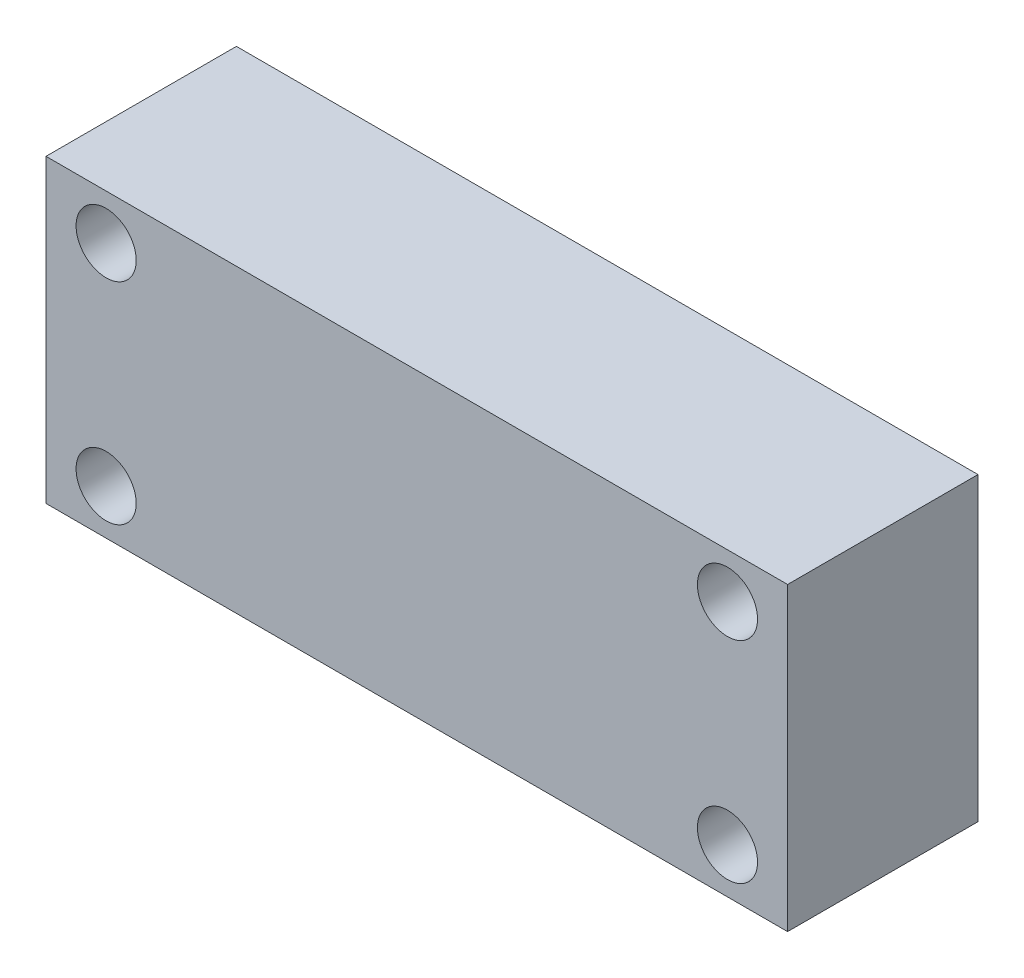
ISO-10303-21;
HEADER;
FILE_DESCRIPTION(('STEP AP214'),'2;1');
FILE_NAME('part.step','',(''),(''),'','','');
FILE_SCHEMA(('AUTOMOTIVE_DESIGN { 1 0 10303 214 1 1 1 1 }'));
ENDSEC;
DATA;
#1=APPLICATION_CONTEXT('core data for automotive mechanical design processes');
#2=APPLICATION_PROTOCOL_DEFINITION('international standard','automotive_design',2000,#1);
#3=PRODUCT_CONTEXT('',#1,'mechanical');
#4=PRODUCT('Part','Part','',(#3));
#5=PRODUCT_RELATED_PRODUCT_CATEGORY('part','',(#4));
#6=PRODUCT_DEFINITION_FORMATION('','',#4);
#7=PRODUCT_DEFINITION_CONTEXT('part definition',#1,'design');
#8=PRODUCT_DEFINITION('design','',#6,#7);
#9=PRODUCT_DEFINITION_SHAPE('','',#8);
#10=(LENGTH_UNIT() NAMED_UNIT(*) SI_UNIT(.MILLI.,.METRE.));
#11=(NAMED_UNIT(*) PLANE_ANGLE_UNIT() SI_UNIT($,.RADIAN.));
#12=(NAMED_UNIT(*) SI_UNIT($,.STERADIAN.) SOLID_ANGLE_UNIT());
#13=UNCERTAINTY_MEASURE_WITH_UNIT(LENGTH_MEASURE(1.E-05),#10,'distance_accuracy_value','');
#14=(GEOMETRIC_REPRESENTATION_CONTEXT(3) GLOBAL_UNCERTAINTY_ASSIGNED_CONTEXT((#13)) GLOBAL_UNIT_ASSIGNED_CONTEXT((#10,
#11,#12)) REPRESENTATION_CONTEXT('',''));
#15=CARTESIAN_POINT('',(0.,0.,0.));
#16=DIRECTION('',(0.,0.,1.));
#17=DIRECTION('',(1.,0.,0.));
#18=AXIS2_PLACEMENT_3D('',#15,#16,#17);
#19=CARTESIAN_POINT('',(21.,0.,-10.));
#20=DIRECTION('',(0.,0.,1.));
#21=DIRECTION('',(1.,0.,0.));
#22=AXIS2_PLACEMENT_3D('',#19,#20,#21);
#23=PLANE('',#22);
#24=CARTESIAN_POINT('',(21.,0.,-10.));
#25=DIRECTION('',(0.,0.,1.));
#26=DIRECTION('',(1.,0.,0.));
#27=AXIS2_PLACEMENT_3D('',#24,#25,#26);
#28=CIRCLE('',#27,5.);
#29=CARTESIAN_POINT('',(26.,0.,-10.));
#30=VERTEX_POINT('',#29);
#31=EDGE_CURVE('E11',#30,#30,#28,.T.);
#32=ORIENTED_EDGE('',*,*,#31,.F.);
#33=EDGE_LOOP('',(#32));
#34=FACE_BOUND('',#33,.T.);
#35=ADVANCED_FACE('F17',(#34),#23,.F.);
#36=CARTESIAN_POINT('',(21.,0.,-10.));
#37=DIRECTION('',(0.,0.,-1.));
#38=DIRECTION('',(-1.,0.,0.));
#39=AXIS2_PLACEMENT_3D('',#36,#37,#38);
#40=CYLINDRICAL_SURFACE('',#39,5.);
#41=CARTESIAN_POINT('',(21.,0.,-20.));
#42=DIRECTION('',(0.,0.,1.));
#43=DIRECTION('',(1.,0.,0.));
#44=AXIS2_PLACEMENT_3D('',#41,#42,#43);
#45=CIRCLE('',#44,5.);
#46=CARTESIAN_POINT('',(26.,0.,-20.));
#47=VERTEX_POINT('',#46);
#48=EDGE_CURVE('E196',#47,#47,#45,.T.);
#49=ORIENTED_EDGE('',*,*,#48,.F.);
#50=EDGE_LOOP('',(#49));
#51=FACE_BOUND('',#50,.T.);
#52=ORIENTED_EDGE('',*,*,#31,.T.);
#53=EDGE_LOOP('',(#52));
#54=FACE_BOUND('',#53,.T.);
#55=ADVANCED_FACE('F268',(#51,#54),#40,.F.);
#56=CARTESIAN_POINT('',(-37.,15.,-19.));
#57=DIRECTION('',(-0.707106781186548,0.,-0.707106781186548));
#58=DIRECTION('',(-0.707106781186548,0.,0.707106781186548));
#59=AXIS2_PLACEMENT_3D('',#56,#57,#58);
#60=PLANE('',#59);
#61=DIRECTION('',(0.577350269189626,-0.577350269189626,-0.577350269189626));
#62=VECTOR('',#61,1.);
#63=CARTESIAN_POINT('',(-12.3333333333333,-9.66666666666667,-43.6666666666667));
#64=LINE('',#63,#62);
#65=CARTESIAN_POINT('',(-37.,15.,-19.));
#66=VERTEX_POINT('',#65);
#67=CARTESIAN_POINT('',(-36.,14.,-20.));
#68=VERTEX_POINT('',#67);
#69=EDGE_CURVE('E135',#66,#68,#64,.T.);
#70=ORIENTED_EDGE('',*,*,#69,.T.);
#71=DIRECTION('',(0.,1.,0.));
#72=VECTOR('',#71,1.);
#73=CARTESIAN_POINT('',(-36.,15.,-20.));
#74=LINE('',#73,#72);
#75=CARTESIAN_POINT('',(-36.,-14.,-20.));
#76=VERTEX_POINT('',#75);
#77=EDGE_CURVE('E129',#76,#68,#74,.T.);
#78=ORIENTED_EDGE('',*,*,#77,.F.);
#79=DIRECTION('',(-0.577350269189626,-0.577350269189626,0.577350269189626));
#80=VECTOR('',#79,1.);
#81=CARTESIAN_POINT('',(-37.,-15.,-19.));
#82=LINE('',#81,#80);
#83=CARTESIAN_POINT('',(-37.,-15.,-19.));
#84=VERTEX_POINT('',#83);
#85=EDGE_CURVE('E25',#76,#84,#82,.T.);
#86=ORIENTED_EDGE('',*,*,#85,.T.);
#87=DIRECTION('',(0.,-1.,0.));
#88=VECTOR('',#87,1.);
#89=CARTESIAN_POINT('',(-37.,-15.,-19.));
#90=LINE('',#89,#88);
#91=EDGE_CURVE('E126',#66,#84,#90,.T.);
#92=ORIENTED_EDGE('',*,*,#91,.F.);
#93=EDGE_LOOP('',(#70,#78,#86,#92));
#94=FACE_BOUND('',#93,.T.);
#95=ADVANCED_FACE('F125',(#94),#60,.T.);
#96=CARTESIAN_POINT('',(-37.,-15.,-19.));
#97=DIRECTION('',(0.,-0.707106781186548,-0.707106781186548));
#98=DIRECTION('',(0.,-0.707106781186548,0.707106781186548));
#99=AXIS2_PLACEMENT_3D('',#96,#97,#98);
#100=PLANE('',#99);
#101=DIRECTION('',(0.577350269189626,-0.577350269189626,0.577350269189626));
#102=VECTOR('',#101,1.);
#103=CARTESIAN_POINT('',(12.3333333333333,9.66666666666667,-43.6666666666667));
#104=LINE('',#103,#102);
#105=CARTESIAN_POINT('',(36.,-14.,-20.));
#106=VERTEX_POINT('',#105);
#107=CARTESIAN_POINT('',(37.,-15.,-19.));
#108=VERTEX_POINT('',#107);
#109=EDGE_CURVE('E151',#106,#108,#104,.T.);
#110=ORIENTED_EDGE('',*,*,#109,.T.);
#111=DIRECTION('',(1.,0.,0.));
#112=VECTOR('',#111,1.);
#113=CARTESIAN_POINT('',(37.,-15.,-19.));
#114=LINE('',#113,#112);
#115=EDGE_CURVE('E149',#84,#108,#114,.T.);
#116=ORIENTED_EDGE('',*,*,#115,.F.);
#117=ORIENTED_EDGE('',*,*,#85,.F.);
#118=DIRECTION('',(-1.,0.,0.));
#119=VECTOR('',#118,1.);
#120=CARTESIAN_POINT('',(-37.,-14.,-20.));
#121=LINE('',#120,#119);
#122=EDGE_CURVE('E178',#106,#76,#121,.T.);
#123=ORIENTED_EDGE('',*,*,#122,.F.);
#124=EDGE_LOOP('',(#110,#116,#117,#123));
#125=FACE_BOUND('',#124,.T.);
#126=ADVANCED_FACE('F150',(#125),#100,.T.);
#127=CARTESIAN_POINT('',(37.,15.,-19.));
#128=DIRECTION('',(0.,0.707106781186548,-0.707106781186548));
#129=DIRECTION('',(-1.,0.,0.));
#130=AXIS2_PLACEMENT_3D('',#127,#128,#129);
#131=PLANE('',#130);
#132=DIRECTION('',(-0.577350269189626,-0.577350269189626,-0.577350269189626));
#133=VECTOR('',#132,1.);
#134=CARTESIAN_POINT('',(27.,5.,-29.));
#135=LINE('',#134,#133);
#136=CARTESIAN_POINT('',(37.,15.,-19.));
#137=VERTEX_POINT('',#136);
#138=CARTESIAN_POINT('',(36.,14.,-20.));
#139=VERTEX_POINT('',#138);
#140=EDGE_CURVE('E233',#137,#139,#135,.T.);
#141=ORIENTED_EDGE('',*,*,#140,.T.);
#142=DIRECTION('',(1.,0.,0.));
#143=VECTOR('',#142,1.);
#144=CARTESIAN_POINT('',(37.,14.,-20.));
#145=LINE('',#144,#143);
#146=EDGE_CURVE('E177',#68,#139,#145,.T.);
#147=ORIENTED_EDGE('',*,*,#146,.F.);
#148=ORIENTED_EDGE('',*,*,#69,.F.);
#149=DIRECTION('',(-1.,0.,0.));
#150=VECTOR('',#149,1.);
#151=CARTESIAN_POINT('',(-37.,15.,-19.));
#152=LINE('',#151,#150);
#153=EDGE_CURVE('E168',#137,#66,#152,.T.);
#154=ORIENTED_EDGE('',*,*,#153,.F.);
#155=EDGE_LOOP('',(#141,#147,#148,#154));
#156=FACE_BOUND('',#155,.T.);
#157=ADVANCED_FACE('F241',(#156),#131,.T.);
#158=CARTESIAN_POINT('',(37.,-15.,-19.));
#159=DIRECTION('',(0.707106781186548,0.,-0.707106781186548));
#160=DIRECTION('',(0.,-1.,0.));
#161=AXIS2_PLACEMENT_3D('',#158,#159,#160);
#162=PLANE('',#161);
#163=ORIENTED_EDGE('',*,*,#109,.F.);
#164=DIRECTION('',(0.,-1.,0.));
#165=VECTOR('',#164,1.);
#166=CARTESIAN_POINT('',(36.,-15.,-20.));
#167=LINE('',#166,#165);
#168=EDGE_CURVE('E204',#139,#106,#167,.T.);
#169=ORIENTED_EDGE('',*,*,#168,.F.);
#170=ORIENTED_EDGE('',*,*,#140,.F.);
#171=DIRECTION('',(0.,1.,0.));
#172=VECTOR('',#171,1.);
#173=CARTESIAN_POINT('',(37.,15.,-19.));
#174=LINE('',#173,#172);
#175=EDGE_CURVE('E174',#108,#137,#174,.T.);
#176=ORIENTED_EDGE('',*,*,#175,.F.);
#177=EDGE_LOOP('',(#163,#169,#170,#176));
#178=FACE_BOUND('',#177,.T.);
#179=ADVANCED_FACE('F247',(#178),#162,.T.);
#180=CARTESIAN_POINT('',(31.,10.5,11.7554473412205));
#181=DIRECTION('',(0.,0.,-1.));
#182=DIRECTION('',(-1.,0.,0.));
#183=AXIS2_PLACEMENT_3D('',#180,#181,#182);
#184=CYLINDRICAL_SURFACE('',#183,3.);
#185=CARTESIAN_POINT('',(31.,10.5,-20.));
#186=DIRECTION('',(0.,0.,1.));
#187=DIRECTION('',(1.,0.,0.));
#188=AXIS2_PLACEMENT_3D('',#185,#186,#187);
#189=CIRCLE('',#188,3.);
#190=CARTESIAN_POINT('',(34.,10.5,-20.));
#191=VERTEX_POINT('',#190);
#192=EDGE_CURVE('E208',#191,#191,#189,.T.);
#193=ORIENTED_EDGE('',*,*,#192,.F.);
#194=EDGE_LOOP('',(#193));
#195=FACE_BOUND('',#194,.T.);
#196=CARTESIAN_POINT('',(31.,10.5,0.));
#197=DIRECTION('',(0.,0.,-1.));
#198=DIRECTION('',(1.,0.,0.));
#199=AXIS2_PLACEMENT_3D('',#196,#197,#198);
#200=CIRCLE('',#199,3.);
#201=CARTESIAN_POINT('',(34.,10.5,0.));
#202=VERTEX_POINT('',#201);
#203=EDGE_CURVE('E220',#202,#202,#200,.T.);
#204=ORIENTED_EDGE('',*,*,#203,.F.);
#205=EDGE_LOOP('',(#204));
#206=FACE_BOUND('',#205,.T.);
#207=ADVANCED_FACE('F355',(#195,#206),#184,.F.);
#208=CARTESIAN_POINT('',(31.,-10.5,11.7554473412205));
#209=DIRECTION('',(0.,0.,-1.));
#210=DIRECTION('',(-1.,0.,0.));
#211=AXIS2_PLACEMENT_3D('',#208,#209,#210);
#212=CYLINDRICAL_SURFACE('',#211,3.);
#213=CARTESIAN_POINT('',(31.,-10.5,-20.));
#214=DIRECTION('',(0.,0.,1.));
#215=DIRECTION('',(1.,0.,0.));
#216=AXIS2_PLACEMENT_3D('',#213,#214,#215);
#217=CIRCLE('',#216,3.);
#218=CARTESIAN_POINT('',(34.,-10.5,-20.));
#219=VERTEX_POINT('',#218);
#220=EDGE_CURVE('E211',#219,#219,#217,.T.);
#221=ORIENTED_EDGE('',*,*,#220,.F.);
#222=EDGE_LOOP('',(#221));
#223=FACE_BOUND('',#222,.T.);
#224=CARTESIAN_POINT('',(31.,-10.5,0.));
#225=DIRECTION('',(0.,0.,-1.));
#226=DIRECTION('',(1.,0.,0.));
#227=AXIS2_PLACEMENT_3D('',#224,#225,#226);
#228=CIRCLE('',#227,3.);
#229=CARTESIAN_POINT('',(34.,-10.5,0.));
#230=VERTEX_POINT('',#229);
#231=EDGE_CURVE('E223',#230,#230,#228,.T.);
#232=ORIENTED_EDGE('',*,*,#231,.F.);
#233=EDGE_LOOP('',(#232));
#234=FACE_BOUND('',#233,.T.);
#235=ADVANCED_FACE('F344',(#223,#234),#212,.F.);
#236=CARTESIAN_POINT('',(-31.,10.5,11.7554473412205));
#237=DIRECTION('',(0.,0.,-1.));
#238=DIRECTION('',(-1.,0.,0.));
#239=AXIS2_PLACEMENT_3D('',#236,#237,#238);
#240=CYLINDRICAL_SURFACE('',#239,3.);
#241=CARTESIAN_POINT('',(-31.,10.5,-20.));
#242=DIRECTION('',(0.,0.,1.));
#243=DIRECTION('',(1.,0.,0.));
#244=AXIS2_PLACEMENT_3D('',#241,#242,#243);
#245=CIRCLE('',#244,3.);
#246=CARTESIAN_POINT('',(-28.,10.5,-20.));
#247=VERTEX_POINT('',#246);
#248=EDGE_CURVE('E214',#247,#247,#245,.T.);
#249=ORIENTED_EDGE('',*,*,#248,.F.);
#250=EDGE_LOOP('',(#249));
#251=FACE_BOUND('',#250,.T.);
#252=CARTESIAN_POINT('',(-31.,10.5,0.));
#253=DIRECTION('',(0.,0.,-1.));
#254=DIRECTION('',(1.,0.,0.));
#255=AXIS2_PLACEMENT_3D('',#252,#253,#254);
#256=CIRCLE('',#255,3.);
#257=CARTESIAN_POINT('',(-28.,10.5,0.));
#258=VERTEX_POINT('',#257);
#259=EDGE_CURVE('E226',#258,#258,#256,.T.);
#260=ORIENTED_EDGE('',*,*,#259,.F.);
#261=EDGE_LOOP('',(#260));
#262=FACE_BOUND('',#261,.T.);
#263=ADVANCED_FACE('F333',(#251,#262),#240,.F.);
#264=CARTESIAN_POINT('',(-31.,-10.5,11.7554473412205));
#265=DIRECTION('',(0.,0.,-1.));
#266=DIRECTION('',(-1.,0.,0.));
#267=AXIS2_PLACEMENT_3D('',#264,#265,#266);
#268=CYLINDRICAL_SURFACE('',#267,3.);
#269=CARTESIAN_POINT('',(-31.,-10.5,-20.));
#270=DIRECTION('',(0.,0.,1.));
#271=DIRECTION('',(1.,0.,0.));
#272=AXIS2_PLACEMENT_3D('',#269,#270,#271);
#273=CIRCLE('',#272,3.);
#274=CARTESIAN_POINT('',(-28.,-10.5,-20.));
#275=VERTEX_POINT('',#274);
#276=EDGE_CURVE('E217',#275,#275,#273,.T.);
#277=ORIENTED_EDGE('',*,*,#276,.F.);
#278=EDGE_LOOP('',(#277));
#279=FACE_BOUND('',#278,.T.);
#280=CARTESIAN_POINT('',(-31.,-10.5,0.));
#281=DIRECTION('',(0.,0.,-1.));
#282=DIRECTION('',(1.,0.,0.));
#283=AXIS2_PLACEMENT_3D('',#280,#281,#282);
#284=CIRCLE('',#283,3.);
#285=CARTESIAN_POINT('',(-28.,-10.5,0.));
#286=VERTEX_POINT('',#285);
#287=EDGE_CURVE('E40',#286,#286,#284,.T.);
#288=ORIENTED_EDGE('',*,*,#287,.F.);
#289=EDGE_LOOP('',(#288));
#290=FACE_BOUND('',#289,.T.);
#291=ADVANCED_FACE('F323',(#279,#290),#268,.F.);
#292=CARTESIAN_POINT('',(0.,0.,0.));
#293=DIRECTION('',(0.,0.,1.));
#294=DIRECTION('',(1.,0.,0.));
#295=AXIS2_PLACEMENT_3D('',#292,#293,#294);
#296=PLANE('',#295);
#297=DIRECTION('',(1.,0.,0.));
#298=VECTOR('',#297,1.);
#299=CARTESIAN_POINT('',(-37.,-15.,0.));
#300=LINE('',#299,#298);
#301=CARTESIAN_POINT('',(-37.,-15.,0.));
#302=VERTEX_POINT('',#301);
#303=CARTESIAN_POINT('',(37.,-15.,0.));
#304=VERTEX_POINT('',#303);
#305=EDGE_CURVE('E161',#302,#304,#300,.T.);
#306=ORIENTED_EDGE('',*,*,#305,.T.);
#307=DIRECTION('',(0.,1.,0.));
#308=VECTOR('',#307,1.);
#309=CARTESIAN_POINT('',(37.,-15.,0.));
#310=LINE('',#309,#308);
#311=CARTESIAN_POINT('',(37.,15.,0.));
#312=VERTEX_POINT('',#311);
#313=EDGE_CURVE('E171',#304,#312,#310,.T.);
#314=ORIENTED_EDGE('',*,*,#313,.T.);
#315=DIRECTION('',(-1.,0.,0.));
#316=VECTOR('',#315,1.);
#317=CARTESIAN_POINT('',(37.,15.,0.));
#318=LINE('',#317,#316);
#319=CARTESIAN_POINT('',(-37.,15.,0.));
#320=VERTEX_POINT('',#319);
#321=EDGE_CURVE('E146',#312,#320,#318,.T.);
#322=ORIENTED_EDGE('',*,*,#321,.T.);
#323=DIRECTION('',(0.,-1.,0.));
#324=VECTOR('',#323,1.);
#325=CARTESIAN_POINT('',(-37.,15.,0.));
#326=LINE('',#325,#324);
#327=EDGE_CURVE('E145',#320,#302,#326,.T.);
#328=ORIENTED_EDGE('',*,*,#327,.T.);
#329=EDGE_LOOP('',(#306,#314,#322,#328));
#330=FACE_BOUND('',#329,.T.);
#331=ORIENTED_EDGE('',*,*,#287,.T.);
#332=EDGE_LOOP('',(#331));
#333=FACE_BOUND('',#332,.T.);
#334=ORIENTED_EDGE('',*,*,#259,.T.);
#335=EDGE_LOOP('',(#334));
#336=FACE_BOUND('',#335,.T.);
#337=ORIENTED_EDGE('',*,*,#231,.T.);
#338=EDGE_LOOP('',(#337));
#339=FACE_BOUND('',#338,.T.);
#340=ORIENTED_EDGE('',*,*,#203,.T.);
#341=EDGE_LOOP('',(#340));
#342=FACE_BOUND('',#341,.T.);
#343=ADVANCED_FACE('F253',(#330,#333,#336,#339,#342),#296,.T.);
#344=CARTESIAN_POINT('',(0.,0.,-20.));
#345=DIRECTION('',(0.,0.,1.));
#346=DIRECTION('',(1.,0.,0.));
#347=AXIS2_PLACEMENT_3D('',#344,#345,#346);
#348=PLANE('',#347);
#349=ORIENTED_EDGE('',*,*,#276,.T.);
#350=EDGE_LOOP('',(#349));
#351=FACE_BOUND('',#350,.T.);
#352=ORIENTED_EDGE('',*,*,#248,.T.);
#353=EDGE_LOOP('',(#352));
#354=FACE_BOUND('',#353,.T.);
#355=ORIENTED_EDGE('',*,*,#220,.T.);
#356=EDGE_LOOP('',(#355));
#357=FACE_BOUND('',#356,.T.);
#358=ORIENTED_EDGE('',*,*,#192,.T.);
#359=EDGE_LOOP('',(#358));
#360=FACE_BOUND('',#359,.T.);
#361=ORIENTED_EDGE('',*,*,#122,.T.);
#362=ORIENTED_EDGE('',*,*,#77,.T.);
#363=ORIENTED_EDGE('',*,*,#146,.T.);
#364=ORIENTED_EDGE('',*,*,#168,.T.);
#365=EDGE_LOOP('',(#361,#362,#363,#364));
#366=FACE_BOUND('',#365,.T.);
#367=ORIENTED_EDGE('',*,*,#48,.T.);
#368=EDGE_LOOP('',(#367));
#369=FACE_BOUND('',#368,.T.);
#370=ADVANCED_FACE('F244',(#351,#354,#357,#360,#366,#369),#348,.F.);
#371=CARTESIAN_POINT('',(-37.,15.,-20.));
#372=DIRECTION('',(-1.,0.,0.));
#373=DIRECTION('',(0.,0.,1.));
#374=AXIS2_PLACEMENT_3D('',#371,#372,#373);
#375=PLANE('',#374);
#376=DIRECTION('',(0.,0.,1.));
#377=VECTOR('',#376,1.);
#378=CARTESIAN_POINT('',(-37.,15.,-20.));
#379=LINE('',#378,#377);
#380=EDGE_CURVE('E142',#66,#320,#379,.T.);
#381=ORIENTED_EDGE('',*,*,#380,.F.);
#382=ORIENTED_EDGE('',*,*,#91,.T.);
#383=DIRECTION('',(0.,0.,1.));
#384=VECTOR('',#383,1.);
#385=CARTESIAN_POINT('',(-37.,-15.,-20.));
#386=LINE('',#385,#384);
#387=EDGE_CURVE('E140',#84,#302,#386,.T.);
#388=ORIENTED_EDGE('',*,*,#387,.T.);
#389=ORIENTED_EDGE('',*,*,#327,.F.);
#390=EDGE_LOOP('',(#381,#382,#388,#389));
#391=FACE_BOUND('',#390,.T.);
#392=ADVANCED_FACE('F138',(#391),#375,.T.);
#393=CARTESIAN_POINT('',(37.,15.,-20.));
#394=DIRECTION('',(0.,1.,0.));
#395=DIRECTION('',(1.,0.,0.));
#396=AXIS2_PLACEMENT_3D('',#393,#394,#395);
#397=PLANE('',#396);
#398=DIRECTION('',(0.,0.,1.));
#399=VECTOR('',#398,1.);
#400=CARTESIAN_POINT('',(37.,15.,-20.));
#401=LINE('',#400,#399);
#402=EDGE_CURVE('E182',#137,#312,#401,.T.);
#403=ORIENTED_EDGE('',*,*,#402,.F.);
#404=ORIENTED_EDGE('',*,*,#153,.T.);
#405=ORIENTED_EDGE('',*,*,#380,.T.);
#406=ORIENTED_EDGE('',*,*,#321,.F.);
#407=EDGE_LOOP('',(#403,#404,#405,#406));
#408=FACE_BOUND('',#407,.T.);
#409=ADVANCED_FACE('F255',(#408),#397,.T.);
#410=CARTESIAN_POINT('',(37.,-15.,-20.));
#411=DIRECTION('',(1.,0.,0.));
#412=DIRECTION('',(0.,1.,0.));
#413=AXIS2_PLACEMENT_3D('',#410,#411,#412);
#414=PLANE('',#413);
#415=DIRECTION('',(0.,0.,1.));
#416=VECTOR('',#415,1.);
#417=CARTESIAN_POINT('',(37.,-15.,-20.));
#418=LINE('',#417,#416);
#419=EDGE_CURVE('E156',#108,#304,#418,.T.);
#420=ORIENTED_EDGE('',*,*,#419,.F.);
#421=ORIENTED_EDGE('',*,*,#175,.T.);
#422=ORIENTED_EDGE('',*,*,#402,.T.);
#423=ORIENTED_EDGE('',*,*,#313,.F.);
#424=EDGE_LOOP('',(#420,#421,#422,#423));
#425=FACE_BOUND('',#424,.T.);
#426=ADVANCED_FACE('F250',(#425),#414,.T.);
#427=CARTESIAN_POINT('',(-37.,-15.,-20.));
#428=DIRECTION('',(0.,-1.,0.));
#429=DIRECTION('',(0.,0.,-1.));
#430=AXIS2_PLACEMENT_3D('',#427,#428,#429);
#431=PLANE('',#430);
#432=ORIENTED_EDGE('',*,*,#387,.F.);
#433=ORIENTED_EDGE('',*,*,#115,.T.);
#434=ORIENTED_EDGE('',*,*,#419,.T.);
#435=ORIENTED_EDGE('',*,*,#305,.F.);
#436=EDGE_LOOP('',(#432,#433,#434,#435));
#437=FACE_BOUND('',#436,.T.);
#438=ADVANCED_FACE('F159',(#437),#431,.T.);
#439=CLOSED_SHELL('',(#35,#55,#95,#126,#157,#179,#207,#235,#263,#291,#343,#370,#392,#409,#426,#438));
#440=MANIFOLD_SOLID_BREP('B1',#439);
#441=ADVANCED_BREP_SHAPE_REPRESENTATION('',(#18,#440),#14);
#442=SHAPE_DEFINITION_REPRESENTATION(#9,#441);
ENDSEC;
END-ISO-10303-21;
